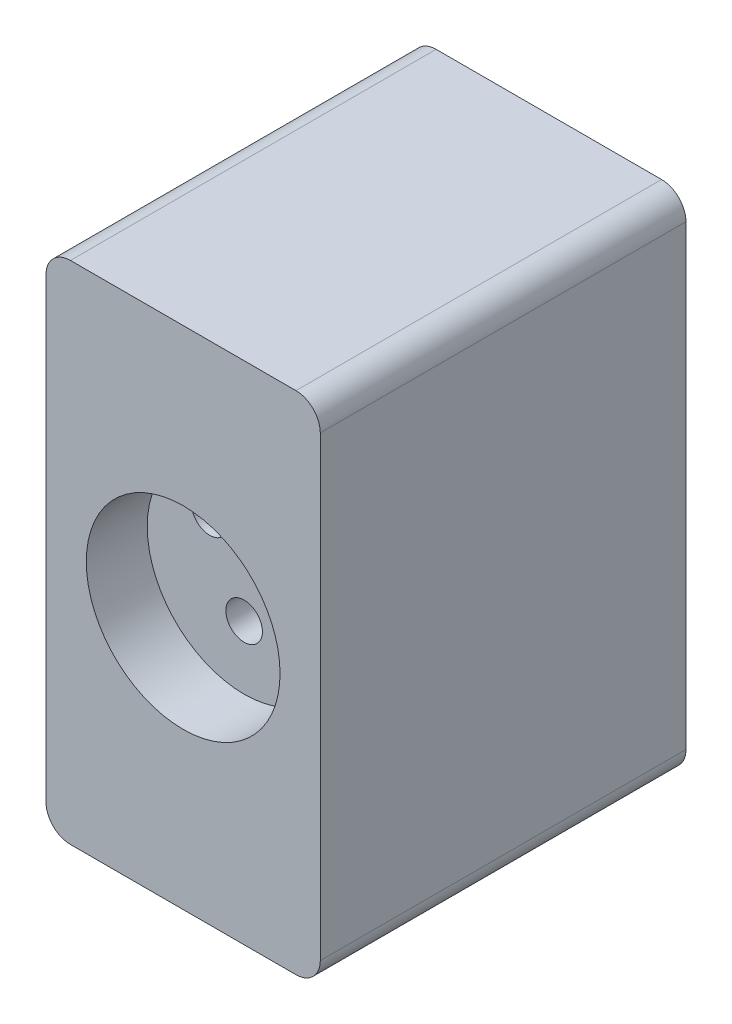
ISO-10303-21;
HEADER;
FILE_DESCRIPTION(('STEP AP214'),'2;1');
FILE_NAME('part.step','',(''),(''),'','','');
FILE_SCHEMA(('AUTOMOTIVE_DESIGN { 1 0 10303 214 1 1 1 1 }'));
ENDSEC;
DATA;
#1=APPLICATION_CONTEXT('core data for automotive mechanical design processes');
#2=APPLICATION_PROTOCOL_DEFINITION('international standard','automotive_design',2000,#1);
#3=PRODUCT_CONTEXT('',#1,'mechanical');
#4=PRODUCT('Part','Part','',(#3));
#5=PRODUCT_RELATED_PRODUCT_CATEGORY('part','',(#4));
#6=PRODUCT_DEFINITION_FORMATION('','',#4);
#7=PRODUCT_DEFINITION_CONTEXT('part definition',#1,'design');
#8=PRODUCT_DEFINITION('design','',#6,#7);
#9=PRODUCT_DEFINITION_SHAPE('','',#8);
#10=(LENGTH_UNIT() NAMED_UNIT(*) SI_UNIT(.MILLI.,.METRE.));
#11=(NAMED_UNIT(*) PLANE_ANGLE_UNIT() SI_UNIT($,.RADIAN.));
#12=(NAMED_UNIT(*) SI_UNIT($,.STERADIAN.) SOLID_ANGLE_UNIT());
#13=UNCERTAINTY_MEASURE_WITH_UNIT(LENGTH_MEASURE(1.E-05),#10,'distance_accuracy_value','');
#14=(GEOMETRIC_REPRESENTATION_CONTEXT(3) GLOBAL_UNCERTAINTY_ASSIGNED_CONTEXT((#13)) GLOBAL_UNIT_ASSIGNED_CONTEXT((#10,
#11,#12)) REPRESENTATION_CONTEXT('',''));
#15=CARTESIAN_POINT('',(0.,0.,0.));
#16=DIRECTION('',(0.,0.,1.));
#17=DIRECTION('',(1.,0.,0.));
#18=AXIS2_PLACEMENT_3D('',#15,#16,#17);
#19=CARTESIAN_POINT('',(-18.5,-37.5,60.));
#20=DIRECTION('',(0.,0.,-1.));
#21=DIRECTION('',(-1.,0.,0.));
#22=AXIS2_PLACEMENT_3D('',#19,#20,#21);
#23=CYLINDRICAL_SURFACE('',#22,4.);
#24=CARTESIAN_POINT('',(-18.5,-37.5,0.));
#25=DIRECTION('',(0.,0.,1.));
#26=DIRECTION('',(-1.,0.,0.));
#27=AXIS2_PLACEMENT_3D('',#24,#25,#26);
#28=CIRCLE('',#27,4.);
#29=CARTESIAN_POINT('',(-22.5,-37.5,0.));
#30=VERTEX_POINT('',#29);
#31=CARTESIAN_POINT('',(-18.5,-41.5,0.));
#32=VERTEX_POINT('',#31);
#33=EDGE_CURVE('E129',#30,#32,#28,.T.);
#34=ORIENTED_EDGE('',*,*,#33,.T.);
#35=DIRECTION('',(0.,0.,-1.));
#36=VECTOR('',#35,1.);
#37=CARTESIAN_POINT('',(-18.5,-41.5,60.));
#38=LINE('',#37,#36);
#39=CARTESIAN_POINT('',(-18.5,-41.5,60.));
#40=VERTEX_POINT('',#39);
#41=EDGE_CURVE('E11',#40,#32,#38,.T.);
#42=ORIENTED_EDGE('',*,*,#41,.F.);
#43=CARTESIAN_POINT('',(-18.5,-37.5,60.));
#44=DIRECTION('',(0.,0.,1.));
#45=DIRECTION('',(-1.,0.,0.));
#46=AXIS2_PLACEMENT_3D('',#43,#44,#45);
#47=CIRCLE('',#46,4.);
#48=CARTESIAN_POINT('',(-22.5,-37.5,60.));
#49=VERTEX_POINT('',#48);
#50=EDGE_CURVE('E144',#49,#40,#47,.T.);
#51=ORIENTED_EDGE('',*,*,#50,.F.);
#52=DIRECTION('',(0.,0.,-1.));
#53=VECTOR('',#52,1.);
#54=CARTESIAN_POINT('',(-22.5,-37.5,60.));
#55=LINE('',#54,#53);
#56=EDGE_CURVE('E125',#49,#30,#55,.T.);
#57=ORIENTED_EDGE('',*,*,#56,.T.);
#58=EDGE_LOOP('',(#34,#42,#51,#57));
#59=FACE_BOUND('',#58,.T.);
#60=ADVANCED_FACE('F33',(#59),#23,.T.);
#61=CARTESIAN_POINT('',(-18.5,-41.5,60.));
#62=DIRECTION('',(0.,1.,0.));
#63=DIRECTION('',(0.,0.,1.));
#64=AXIS2_PLACEMENT_3D('',#61,#62,#63);
#65=PLANE('',#64);
#66=DIRECTION('',(1.,0.,0.));
#67=VECTOR('',#66,1.);
#68=CARTESIAN_POINT('',(-18.5,-41.5,0.));
#69=LINE('',#68,#67);
#70=CARTESIAN_POINT('',(18.5,-41.5,0.));
#71=VERTEX_POINT('',#70);
#72=EDGE_CURVE('E132',#32,#71,#69,.T.);
#73=ORIENTED_EDGE('',*,*,#72,.T.);
#74=DIRECTION('',(0.,0.,-1.));
#75=VECTOR('',#74,1.);
#76=CARTESIAN_POINT('',(18.5,-41.5,60.));
#77=LINE('',#76,#75);
#78=CARTESIAN_POINT('',(18.5,-41.5,60.));
#79=VERTEX_POINT('',#78);
#80=EDGE_CURVE('E41',#79,#71,#77,.T.);
#81=ORIENTED_EDGE('',*,*,#80,.F.);
#82=DIRECTION('',(1.,0.,0.));
#83=VECTOR('',#82,1.);
#84=CARTESIAN_POINT('',(-18.5,-41.5,60.));
#85=LINE('',#84,#83);
#86=EDGE_CURVE('E92',#40,#79,#85,.T.);
#87=ORIENTED_EDGE('',*,*,#86,.F.);
#88=ORIENTED_EDGE('',*,*,#41,.T.);
#89=EDGE_LOOP('',(#73,#81,#87,#88));
#90=FACE_BOUND('',#89,.T.);
#91=ADVANCED_FACE('F237',(#90),#65,.F.);
#92=CARTESIAN_POINT('',(18.5,-37.5,60.));
#93=DIRECTION('',(0.,0.,-1.));
#94=DIRECTION('',(-1.,0.,0.));
#95=AXIS2_PLACEMENT_3D('',#92,#93,#94);
#96=CYLINDRICAL_SURFACE('',#95,4.);
#97=CARTESIAN_POINT('',(18.5,-37.5,0.));
#98=DIRECTION('',(0.,0.,1.));
#99=DIRECTION('',(1.,0.,0.));
#100=AXIS2_PLACEMENT_3D('',#97,#98,#99);
#101=CIRCLE('',#100,4.);
#102=CARTESIAN_POINT('',(22.5,-37.5,0.));
#103=VERTEX_POINT('',#102);
#104=EDGE_CURVE('E135',#71,#103,#101,.T.);
#105=ORIENTED_EDGE('',*,*,#104,.T.);
#106=DIRECTION('',(0.,0.,-1.));
#107=VECTOR('',#106,1.);
#108=CARTESIAN_POINT('',(22.5,-37.5,60.));
#109=LINE('',#108,#107);
#110=CARTESIAN_POINT('',(22.5,-37.5,60.));
#111=VERTEX_POINT('',#110);
#112=EDGE_CURVE('E151',#111,#103,#109,.T.);
#113=ORIENTED_EDGE('',*,*,#112,.F.);
#114=CARTESIAN_POINT('',(18.5,-37.5,60.));
#115=DIRECTION('',(0.,0.,1.));
#116=DIRECTION('',(1.,0.,0.));
#117=AXIS2_PLACEMENT_3D('',#114,#115,#116);
#118=CIRCLE('',#117,4.);
#119=EDGE_CURVE('E159',#79,#111,#118,.T.);
#120=ORIENTED_EDGE('',*,*,#119,.F.);
#121=ORIENTED_EDGE('',*,*,#80,.T.);
#122=EDGE_LOOP('',(#105,#113,#120,#121));
#123=FACE_BOUND('',#122,.T.);
#124=ADVANCED_FACE('F157',(#123),#96,.T.);
#125=CARTESIAN_POINT('',(22.5,-37.5,60.));
#126=DIRECTION('',(-1.,0.,0.));
#127=DIRECTION('',(0.,0.,1.));
#128=AXIS2_PLACEMENT_3D('',#125,#126,#127);
#129=PLANE('',#128);
#130=DIRECTION('',(0.,1.,0.));
#131=VECTOR('',#130,1.);
#132=CARTESIAN_POINT('',(22.5,-37.5,0.));
#133=LINE('',#132,#131);
#134=CARTESIAN_POINT('',(22.5,37.5,0.));
#135=VERTEX_POINT('',#134);
#136=EDGE_CURVE('E137',#103,#135,#133,.T.);
#137=ORIENTED_EDGE('',*,*,#136,.T.);
#138=DIRECTION('',(0.,0.,-1.));
#139=VECTOR('',#138,1.);
#140=CARTESIAN_POINT('',(22.5,37.5,60.));
#141=LINE('',#140,#139);
#142=CARTESIAN_POINT('',(22.5,37.5,60.));
#143=VERTEX_POINT('',#142);
#144=EDGE_CURVE('E148',#143,#135,#141,.T.);
#145=ORIENTED_EDGE('',*,*,#144,.F.);
#146=DIRECTION('',(0.,1.,0.));
#147=VECTOR('',#146,1.);
#148=CARTESIAN_POINT('',(22.5,-37.5,60.));
#149=LINE('',#148,#147);
#150=EDGE_CURVE('E171',#111,#143,#149,.T.);
#151=ORIENTED_EDGE('',*,*,#150,.F.);
#152=ORIENTED_EDGE('',*,*,#112,.T.);
#153=EDGE_LOOP('',(#137,#145,#151,#152));
#154=FACE_BOUND('',#153,.T.);
#155=ADVANCED_FACE('F167',(#154),#129,.F.);
#156=CARTESIAN_POINT('',(18.5,37.5,60.));
#157=DIRECTION('',(0.,0.,-1.));
#158=DIRECTION('',(-1.,0.,0.));
#159=AXIS2_PLACEMENT_3D('',#156,#157,#158);
#160=CYLINDRICAL_SURFACE('',#159,4.);
#161=CARTESIAN_POINT('',(18.5,37.5,0.));
#162=DIRECTION('',(0.,0.,1.));
#163=DIRECTION('',(1.,0.,0.));
#164=AXIS2_PLACEMENT_3D('',#161,#162,#163);
#165=CIRCLE('',#164,4.);
#166=CARTESIAN_POINT('',(18.5,41.5,0.));
#167=VERTEX_POINT('',#166);
#168=EDGE_CURVE('E139',#135,#167,#165,.T.);
#169=ORIENTED_EDGE('',*,*,#168,.T.);
#170=DIRECTION('',(0.,0.,-1.));
#171=VECTOR('',#170,1.);
#172=CARTESIAN_POINT('',(18.5,41.5,60.));
#173=LINE('',#172,#171);
#174=CARTESIAN_POINT('',(18.5,41.5,60.));
#175=VERTEX_POINT('',#174);
#176=EDGE_CURVE('E120',#175,#167,#173,.T.);
#177=ORIENTED_EDGE('',*,*,#176,.F.);
#178=CARTESIAN_POINT('',(18.5,37.5,60.));
#179=DIRECTION('',(0.,0.,1.));
#180=DIRECTION('',(1.,0.,0.));
#181=AXIS2_PLACEMENT_3D('',#178,#179,#180);
#182=CIRCLE('',#181,4.);
#183=EDGE_CURVE('E111',#143,#175,#182,.T.);
#184=ORIENTED_EDGE('',*,*,#183,.F.);
#185=ORIENTED_EDGE('',*,*,#144,.T.);
#186=EDGE_LOOP('',(#169,#177,#184,#185));
#187=FACE_BOUND('',#186,.T.);
#188=ADVANCED_FACE('F170',(#187),#160,.T.);
#189=CARTESIAN_POINT('',(-18.5,41.5,60.));
#190=DIRECTION('',(0.,-1.,0.));
#191=DIRECTION('',(0.,0.,-1.));
#192=AXIS2_PLACEMENT_3D('',#189,#190,#191);
#193=PLANE('',#192);
#194=DIRECTION('',(-1.,0.,0.));
#195=VECTOR('',#194,1.);
#196=CARTESIAN_POINT('',(-18.5,41.5,0.));
#197=LINE('',#196,#195);
#198=CARTESIAN_POINT('',(-18.5,41.5,0.));
#199=VERTEX_POINT('',#198);
#200=EDGE_CURVE('E119',#167,#199,#197,.T.);
#201=ORIENTED_EDGE('',*,*,#200,.T.);
#202=DIRECTION('',(0.,0.,-1.));
#203=VECTOR('',#202,1.);
#204=CARTESIAN_POINT('',(-18.5,41.5,60.));
#205=LINE('',#204,#203);
#206=CARTESIAN_POINT('',(-18.5,41.5,60.));
#207=VERTEX_POINT('',#206);
#208=EDGE_CURVE('E116',#207,#199,#205,.T.);
#209=ORIENTED_EDGE('',*,*,#208,.F.);
#210=DIRECTION('',(-1.,0.,0.));
#211=VECTOR('',#210,1.);
#212=CARTESIAN_POINT('',(-18.5,41.5,60.));
#213=LINE('',#212,#211);
#214=EDGE_CURVE('E105',#175,#207,#213,.T.);
#215=ORIENTED_EDGE('',*,*,#214,.F.);
#216=ORIENTED_EDGE('',*,*,#176,.T.);
#217=EDGE_LOOP('',(#201,#209,#215,#216));
#218=FACE_BOUND('',#217,.T.);
#219=ADVANCED_FACE('F117',(#218),#193,.F.);
#220=CARTESIAN_POINT('',(-18.5,37.5,60.));
#221=DIRECTION('',(0.,0.,-1.));
#222=DIRECTION('',(-1.,0.,0.));
#223=AXIS2_PLACEMENT_3D('',#220,#221,#222);
#224=CYLINDRICAL_SURFACE('',#223,4.);
#225=CARTESIAN_POINT('',(-18.5,37.5,0.));
#226=DIRECTION('',(0.,0.,1.));
#227=DIRECTION('',(-1.,0.,0.));
#228=AXIS2_PLACEMENT_3D('',#225,#226,#227);
#229=CIRCLE('',#228,4.);
#230=CARTESIAN_POINT('',(-22.5,37.5,0.));
#231=VERTEX_POINT('',#230);
#232=EDGE_CURVE('E78',#199,#231,#229,.T.);
#233=ORIENTED_EDGE('',*,*,#232,.T.);
#234=DIRECTION('',(0.,0.,-1.));
#235=VECTOR('',#234,1.);
#236=CARTESIAN_POINT('',(-22.5,37.5,60.));
#237=LINE('',#236,#235);
#238=CARTESIAN_POINT('',(-22.5,37.5,60.));
#239=VERTEX_POINT('',#238);
#240=EDGE_CURVE('E121',#239,#231,#237,.T.);
#241=ORIENTED_EDGE('',*,*,#240,.F.);
#242=CARTESIAN_POINT('',(-18.5,37.5,60.));
#243=DIRECTION('',(0.,0.,1.));
#244=DIRECTION('',(-1.,0.,0.));
#245=AXIS2_PLACEMENT_3D('',#242,#243,#244);
#246=CIRCLE('',#245,4.);
#247=EDGE_CURVE('E109',#207,#239,#246,.T.);
#248=ORIENTED_EDGE('',*,*,#247,.F.);
#249=ORIENTED_EDGE('',*,*,#208,.T.);
#250=EDGE_LOOP('',(#233,#241,#248,#249));
#251=FACE_BOUND('',#250,.T.);
#252=ADVANCED_FACE('F123',(#251),#224,.T.);
#253=CARTESIAN_POINT('',(-22.5,-37.5,60.));
#254=DIRECTION('',(1.,0.,0.));
#255=DIRECTION('',(0.,0.,-1.));
#256=AXIS2_PLACEMENT_3D('',#253,#254,#255);
#257=PLANE('',#256);
#258=DIRECTION('',(0.,-1.,0.));
#259=VECTOR('',#258,1.);
#260=CARTESIAN_POINT('',(-22.5,-37.5,0.));
#261=LINE('',#260,#259);
#262=EDGE_CURVE('E84',#231,#30,#261,.T.);
#263=ORIENTED_EDGE('',*,*,#262,.T.);
#264=ORIENTED_EDGE('',*,*,#56,.F.);
#265=DIRECTION('',(0.,-1.,0.));
#266=VECTOR('',#265,1.);
#267=CARTESIAN_POINT('',(-22.5,-37.5,60.));
#268=LINE('',#267,#266);
#269=EDGE_CURVE('E49',#239,#49,#268,.T.);
#270=ORIENTED_EDGE('',*,*,#269,.F.);
#271=ORIENTED_EDGE('',*,*,#240,.T.);
#272=EDGE_LOOP('',(#263,#264,#270,#271));
#273=FACE_BOUND('',#272,.T.);
#274=ADVANCED_FACE('F228',(#273),#257,.F.);
#275=CARTESIAN_POINT('',(-18.5,-37.5,60.));
#276=DIRECTION('',(0.,0.,-1.));
#277=DIRECTION('',(-1.,0.,0.));
#278=AXIS2_PLACEMENT_3D('',#275,#276,#277);
#279=PLANE('',#278);
#280=CARTESIAN_POINT('',(0.,0.,60.));
#281=DIRECTION('',(0.,0.,1.));
#282=DIRECTION('',(1.,0.,0.));
#283=AXIS2_PLACEMENT_3D('',#280,#281,#282);
#284=CIRCLE('',#283,15.8958392371286);
#285=CARTESIAN_POINT('',(15.8958392371286,0.,60.));
#286=VERTEX_POINT('',#285);
#287=EDGE_CURVE('E177',#286,#286,#284,.T.);
#288=ORIENTED_EDGE('',*,*,#287,.F.);
#289=EDGE_LOOP('',(#288));
#290=FACE_BOUND('',#289,.T.);
#291=ORIENTED_EDGE('',*,*,#50,.T.);
#292=ORIENTED_EDGE('',*,*,#86,.T.);
#293=ORIENTED_EDGE('',*,*,#119,.T.);
#294=ORIENTED_EDGE('',*,*,#150,.T.);
#295=ORIENTED_EDGE('',*,*,#183,.T.);
#296=ORIENTED_EDGE('',*,*,#214,.T.);
#297=ORIENTED_EDGE('',*,*,#247,.T.);
#298=ORIENTED_EDGE('',*,*,#269,.T.);
#299=EDGE_LOOP('',(#291,#292,#293,#294,#295,#296,#297,#298));
#300=FACE_BOUND('',#299,.T.);
#301=ADVANCED_FACE('F107',(#290,#300),#279,.F.);
#302=CARTESIAN_POINT('',(-18.5,-37.5,0.));
#303=DIRECTION('',(0.,0.,-1.));
#304=DIRECTION('',(-1.,0.,0.));
#305=AXIS2_PLACEMENT_3D('',#302,#303,#304);
#306=PLANE('',#305);
#307=ORIENTED_EDGE('',*,*,#33,.F.);
#308=ORIENTED_EDGE('',*,*,#262,.F.);
#309=ORIENTED_EDGE('',*,*,#232,.F.);
#310=ORIENTED_EDGE('',*,*,#200,.F.);
#311=ORIENTED_EDGE('',*,*,#168,.F.);
#312=ORIENTED_EDGE('',*,*,#136,.F.);
#313=ORIENTED_EDGE('',*,*,#104,.F.);
#314=ORIENTED_EDGE('',*,*,#72,.F.);
#315=EDGE_LOOP('',(#307,#308,#309,#310,#311,#312,#313,#314));
#316=FACE_BOUND('',#315,.T.);
#317=ADVANCED_FACE('F163',(#316),#306,.T.);
#318=CARTESIAN_POINT('',(0.,0.,50.));
#319=DIRECTION('',(0.,0.,1.));
#320=DIRECTION('',(1.,0.,0.));
#321=AXIS2_PLACEMENT_3D('',#318,#319,#320);
#322=CYLINDRICAL_SURFACE('',#321,15.8958392371286);
#323=CARTESIAN_POINT('',(0.,0.,50.));
#324=DIRECTION('',(0.,0.,1.));
#325=DIRECTION('',(1.,0.,0.));
#326=AXIS2_PLACEMENT_3D('',#323,#324,#325);
#327=CIRCLE('',#326,15.8958392371286);
#328=CARTESIAN_POINT('',(15.8958392371286,0.,50.));
#329=VERTEX_POINT('',#328);
#330=EDGE_CURVE('E133',#329,#329,#327,.T.);
#331=ORIENTED_EDGE('',*,*,#330,.F.);
#332=EDGE_LOOP('',(#331));
#333=FACE_BOUND('',#332,.T.);
#334=ORIENTED_EDGE('',*,*,#287,.T.);
#335=EDGE_LOOP('',(#334));
#336=FACE_BOUND('',#335,.T.);
#337=ADVANCED_FACE('F214',(#333,#336),#322,.F.);
#338=CARTESIAN_POINT('',(0.,0.,50.));
#339=DIRECTION('',(0.,0.,1.));
#340=DIRECTION('',(1.,0.,0.));
#341=AXIS2_PLACEMENT_3D('',#338,#339,#340);
#342=PLANE('',#341);
#343=CARTESIAN_POINT('',(0.,-5.51042277654901,50.));
#344=DIRECTION('',(0.,0.,1.));
#345=DIRECTION('',(1.,0.,0.));
#346=AXIS2_PLACEMENT_3D('',#343,#344,#345);
#347=CIRCLE('',#346,3.);
#348=CARTESIAN_POINT('',(3.,-5.51042277654901,50.));
#349=VERTEX_POINT('',#348);
#350=EDGE_CURVE('E195',#349,#349,#347,.T.);
#351=ORIENTED_EDGE('',*,*,#350,.F.);
#352=EDGE_LOOP('',(#351));
#353=FACE_BOUND('',#352,.T.);
#354=CARTESIAN_POINT('',(-5.64414905735511,6.86455730412749,50.));
#355=DIRECTION('',(0.,0.,1.));
#356=DIRECTION('',(1.,0.,0.));
#357=AXIS2_PLACEMENT_3D('',#354,#355,#356);
#358=CIRCLE('',#357,3.);
#359=CARTESIAN_POINT('',(-2.64414905735511,6.86455730412749,50.));
#360=VERTEX_POINT('',#359);
#361=EDGE_CURVE('E189',#360,#360,#358,.T.);
#362=ORIENTED_EDGE('',*,*,#361,.F.);
#363=EDGE_LOOP('',(#362));
#364=FACE_BOUND('',#363,.T.);
#365=CARTESIAN_POINT('',(7.33884481082292,6.86455730412749,50.));
#366=DIRECTION('',(0.,0.,1.));
#367=DIRECTION('',(1.,0.,0.));
#368=AXIS2_PLACEMENT_3D('',#365,#366,#367);
#369=CIRCLE('',#368,3.);
#370=CARTESIAN_POINT('',(10.3388448108229,6.86455730412749,50.));
#371=VERTEX_POINT('',#370);
#372=EDGE_CURVE('E183',#371,#371,#369,.T.);
#373=ORIENTED_EDGE('',*,*,#372,.F.);
#374=EDGE_LOOP('',(#373));
#375=FACE_BOUND('',#374,.T.);
#376=ORIENTED_EDGE('',*,*,#330,.T.);
#377=EDGE_LOOP('',(#376));
#378=FACE_BOUND('',#377,.T.);
#379=ADVANCED_FACE('F210',(#353,#364,#375,#378),#342,.T.);
#380=CARTESIAN_POINT('',(7.33884481082292,6.86455730412749,9.99999999999999));
#381=DIRECTION('',(0.,0.,1.));
#382=DIRECTION('',(1.,0.,0.));
#383=AXIS2_PLACEMENT_3D('',#380,#381,#382);
#384=CYLINDRICAL_SURFACE('',#383,3.);
#385=CARTESIAN_POINT('',(7.33884481082292,6.86455730412749,9.99999999999999));
#386=DIRECTION('',(0.,0.,1.));
#387=DIRECTION('',(1.,0.,0.));
#388=AXIS2_PLACEMENT_3D('',#385,#386,#387);
#389=CIRCLE('',#388,3.);
#390=CARTESIAN_POINT('',(10.3388448108229,6.86455730412749,9.99999999999999));
#391=VERTEX_POINT('',#390);
#392=EDGE_CURVE('E180',#391,#391,#389,.T.);
#393=ORIENTED_EDGE('',*,*,#392,.F.);
#394=EDGE_LOOP('',(#393));
#395=FACE_BOUND('',#394,.T.);
#396=ORIENTED_EDGE('',*,*,#372,.T.);
#397=EDGE_LOOP('',(#396));
#398=FACE_BOUND('',#397,.T.);
#399=ADVANCED_FACE('F213',(#395,#398),#384,.F.);
#400=CARTESIAN_POINT('',(7.33884481082292,6.86455730412749,9.99999999999999));
#401=DIRECTION('',(0.,0.,1.));
#402=DIRECTION('',(1.,0.,0.));
#403=AXIS2_PLACEMENT_3D('',#400,#401,#402);
#404=PLANE('',#403);
#405=ORIENTED_EDGE('',*,*,#392,.T.);
#406=EDGE_LOOP('',(#405));
#407=FACE_BOUND('',#406,.T.);
#408=ADVANCED_FACE('F295',(#407),#404,.T.);
#409=CARTESIAN_POINT('',(-5.64414905735511,6.86455730412749,9.99999999999999));
#410=DIRECTION('',(0.,0.,1.));
#411=DIRECTION('',(1.,0.,0.));
#412=AXIS2_PLACEMENT_3D('',#409,#410,#411);
#413=CYLINDRICAL_SURFACE('',#412,3.);
#414=CARTESIAN_POINT('',(-5.64414905735511,6.86455730412749,9.99999999999999));
#415=DIRECTION('',(0.,0.,1.));
#416=DIRECTION('',(1.,0.,0.));
#417=AXIS2_PLACEMENT_3D('',#414,#415,#416);
#418=CIRCLE('',#417,3.);
#419=CARTESIAN_POINT('',(-2.64414905735511,6.86455730412749,9.99999999999999));
#420=VERTEX_POINT('',#419);
#421=EDGE_CURVE('E186',#420,#420,#418,.T.);
#422=ORIENTED_EDGE('',*,*,#421,.F.);
#423=EDGE_LOOP('',(#422));
#424=FACE_BOUND('',#423,.T.);
#425=ORIENTED_EDGE('',*,*,#361,.T.);
#426=EDGE_LOOP('',(#425));
#427=FACE_BOUND('',#426,.T.);
#428=ADVANCED_FACE('F305',(#424,#427),#413,.F.);
#429=CARTESIAN_POINT('',(-5.64414905735511,6.86455730412749,9.99999999999999));
#430=DIRECTION('',(0.,0.,1.));
#431=DIRECTION('',(1.,0.,0.));
#432=AXIS2_PLACEMENT_3D('',#429,#430,#431);
#433=PLANE('',#432);
#434=ORIENTED_EDGE('',*,*,#421,.T.);
#435=EDGE_LOOP('',(#434));
#436=FACE_BOUND('',#435,.T.);
#437=ADVANCED_FACE('F206',(#436),#433,.T.);
#438=CARTESIAN_POINT('',(0.,-5.51042277654901,9.99999999999999));
#439=DIRECTION('',(0.,0.,1.));
#440=DIRECTION('',(1.,0.,0.));
#441=AXIS2_PLACEMENT_3D('',#438,#439,#440);
#442=CYLINDRICAL_SURFACE('',#441,3.);
#443=CARTESIAN_POINT('',(0.,-5.51042277654901,9.99999999999999));
#444=DIRECTION('',(0.,0.,1.));
#445=DIRECTION('',(1.,0.,0.));
#446=AXIS2_PLACEMENT_3D('',#443,#444,#445);
#447=CIRCLE('',#446,3.);
#448=CARTESIAN_POINT('',(3.,-5.51042277654901,9.99999999999999));
#449=VERTEX_POINT('',#448);
#450=EDGE_CURVE('E192',#449,#449,#447,.T.);
#451=ORIENTED_EDGE('',*,*,#450,.F.);
#452=EDGE_LOOP('',(#451));
#453=FACE_BOUND('',#452,.T.);
#454=ORIENTED_EDGE('',*,*,#350,.T.);
#455=EDGE_LOOP('',(#454));
#456=FACE_BOUND('',#455,.T.);
#457=ADVANCED_FACE('F203',(#453,#456),#442,.F.);
#458=CARTESIAN_POINT('',(0.,-5.51042277654901,9.99999999999999));
#459=DIRECTION('',(0.,0.,1.));
#460=DIRECTION('',(1.,0.,0.));
#461=AXIS2_PLACEMENT_3D('',#458,#459,#460);
#462=PLANE('',#461);
#463=ORIENTED_EDGE('',*,*,#450,.T.);
#464=EDGE_LOOP('',(#463));
#465=FACE_BOUND('',#464,.T.);
#466=ADVANCED_FACE('F201',(#465),#462,.T.);
#467=CLOSED_SHELL('',(#60,#91,#124,#155,#188,#219,#252,#274,#301,#317,#337,#379,#399,#408,#428,
#437,#457,#466));
#468=MANIFOLD_SOLID_BREP('B2',#467);
#469=ADVANCED_BREP_SHAPE_REPRESENTATION('',(#18,#468),#14);
#470=SHAPE_DEFINITION_REPRESENTATION(#9,#469);
ENDSEC;
END-ISO-10303-21;
